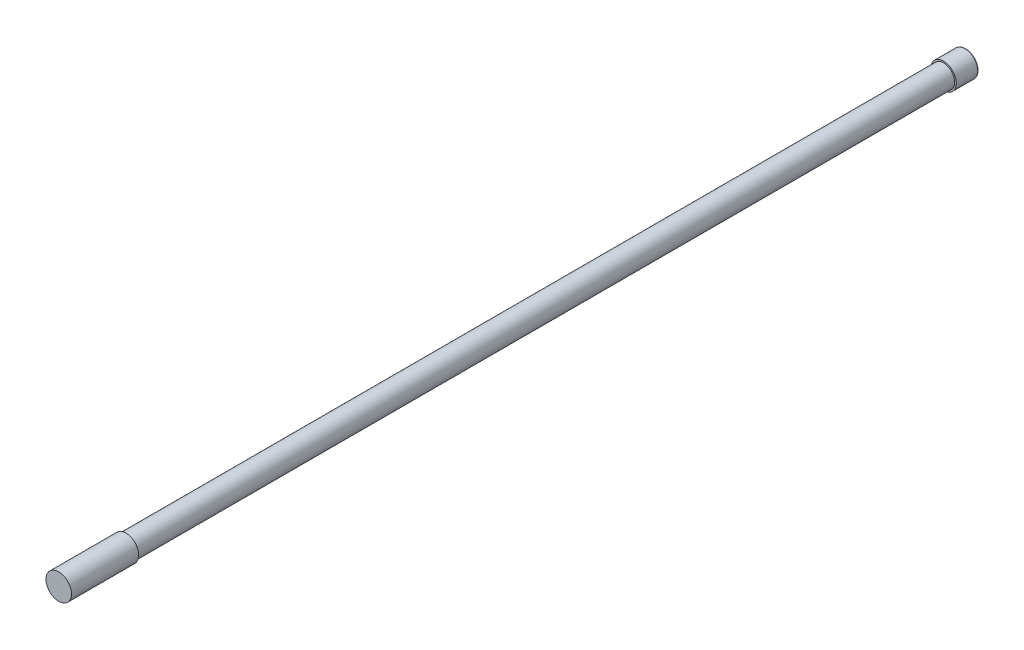
ISO-10303-21;
HEADER;
FILE_DESCRIPTION(('STEP AP214'),'2;1');
FILE_NAME('part.step','',(''),(''),'','','');
FILE_SCHEMA(('AUTOMOTIVE_DESIGN { 1 0 10303 214 1 1 1 1 }'));
ENDSEC;
DATA;
#1=APPLICATION_CONTEXT('core data for automotive mechanical design processes');
#2=APPLICATION_PROTOCOL_DEFINITION('international standard','automotive_design',2000,#1);
#3=PRODUCT_CONTEXT('',#1,'mechanical');
#4=PRODUCT('Part','Part','',(#3));
#5=PRODUCT_RELATED_PRODUCT_CATEGORY('part','',(#4));
#6=PRODUCT_DEFINITION_FORMATION('','',#4);
#7=PRODUCT_DEFINITION_CONTEXT('part definition',#1,'design');
#8=PRODUCT_DEFINITION('design','',#6,#7);
#9=PRODUCT_DEFINITION_SHAPE('','',#8);
#10=(LENGTH_UNIT() NAMED_UNIT(*) SI_UNIT(.MILLI.,.METRE.));
#11=(NAMED_UNIT(*) PLANE_ANGLE_UNIT() SI_UNIT($,.RADIAN.));
#12=(NAMED_UNIT(*) SI_UNIT($,.STERADIAN.) SOLID_ANGLE_UNIT());
#13=UNCERTAINTY_MEASURE_WITH_UNIT(LENGTH_MEASURE(1.E-05),#10,'distance_accuracy_value','');
#14=(GEOMETRIC_REPRESENTATION_CONTEXT(3) GLOBAL_UNCERTAINTY_ASSIGNED_CONTEXT((#13)) GLOBAL_UNIT_ASSIGNED_CONTEXT((#10,
#11,#12)) REPRESENTATION_CONTEXT('',''));
#15=CARTESIAN_POINT('',(0.,0.,0.));
#16=DIRECTION('',(0.,0.,1.));
#17=DIRECTION('',(1.,0.,0.));
#18=AXIS2_PLACEMENT_3D('',#15,#16,#17);
#19=CARTESIAN_POINT('',(0.,0.,-750.));
#20=DIRECTION('',(0.,0.,1.));
#21=DIRECTION('',(1.,0.,0.));
#22=AXIS2_PLACEMENT_3D('',#19,#20,#21);
#23=CYLINDRICAL_SURFACE('',#22,10.);
#24=CARTESIAN_POINT('',(0.,0.,0.));
#25=DIRECTION('',(0.,0.,-1.));
#26=DIRECTION('',(-1.,0.,0.));
#27=AXIS2_PLACEMENT_3D('',#24,#25,#26);
#28=CIRCLE('',#27,10.);
#29=CARTESIAN_POINT('',(-10.,0.,0.));
#30=VERTEX_POINT('',#29);
#31=EDGE_CURVE('E56',#30,#30,#28,.T.);
#32=ORIENTED_EDGE('',*,*,#31,.T.);
#33=EDGE_LOOP('',(#32));
#34=FACE_BOUND('',#33,.T.);
#35=CARTESIAN_POINT('',(0.,0.,-730.));
#36=DIRECTION('',(0.,0.,-1.));
#37=DIRECTION('',(-1.,0.,0.));
#38=AXIS2_PLACEMENT_3D('',#35,#36,#37);
#39=CIRCLE('',#38,10.);
#40=CARTESIAN_POINT('',(-10.,0.,-730.));
#41=VERTEX_POINT('',#40);
#42=EDGE_CURVE('E51',#41,#41,#39,.T.);
#43=ORIENTED_EDGE('',*,*,#42,.F.);
#44=EDGE_LOOP('',(#43));
#45=FACE_BOUND('',#44,.T.);
#46=ADVANCED_FACE('F37',(#34,#45),#23,.T.);
#47=CARTESIAN_POINT('',(0.,0.,60.));
#48=DIRECTION('',(0.,0.,-1.));
#49=DIRECTION('',(-1.,0.,0.));
#50=AXIS2_PLACEMENT_3D('',#47,#48,#49);
#51=CYLINDRICAL_SURFACE('',#50,11.4);
#52=CARTESIAN_POINT('',(0.,0.,60.));
#53=DIRECTION('',(0.,0.,1.));
#54=DIRECTION('',(1.,0.,0.));
#55=AXIS2_PLACEMENT_3D('',#52,#53,#54);
#56=CIRCLE('',#55,11.4);
#57=CARTESIAN_POINT('',(11.4,0.,60.));
#58=VERTEX_POINT('',#57);
#59=EDGE_CURVE('E63',#58,#58,#56,.T.);
#60=ORIENTED_EDGE('',*,*,#59,.F.);
#61=EDGE_LOOP('',(#60));
#62=FACE_BOUND('',#61,.T.);
#63=CARTESIAN_POINT('',(0.,0.,0.));
#64=DIRECTION('',(0.,0.,1.));
#65=DIRECTION('',(1.,0.,0.));
#66=AXIS2_PLACEMENT_3D('',#63,#64,#65);
#67=CIRCLE('',#66,11.4);
#68=CARTESIAN_POINT('',(11.4,0.,0.));
#69=VERTEX_POINT('',#68);
#70=EDGE_CURVE('E59',#69,#69,#67,.T.);
#71=ORIENTED_EDGE('',*,*,#70,.T.);
#72=EDGE_LOOP('',(#71));
#73=FACE_BOUND('',#72,.T.);
#74=ADVANCED_FACE('F89',(#62,#73),#51,.T.);
#75=CARTESIAN_POINT('',(0.,0.,60.));
#76=DIRECTION('',(0.,0.,1.));
#77=DIRECTION('',(1.,0.,0.));
#78=AXIS2_PLACEMENT_3D('',#75,#76,#77);
#79=PLANE('',#78);
#80=ORIENTED_EDGE('',*,*,#59,.T.);
#81=EDGE_LOOP('',(#80));
#82=FACE_BOUND('',#81,.T.);
#83=ADVANCED_FACE('F95',(#82),#79,.T.);
#84=CARTESIAN_POINT('',(0.,0.,0.));
#85=DIRECTION('',(0.,0.,1.));
#86=DIRECTION('',(1.,0.,0.));
#87=AXIS2_PLACEMENT_3D('',#84,#85,#86);
#88=PLANE('',#87);
#89=ORIENTED_EDGE('',*,*,#31,.F.);
#90=EDGE_LOOP('',(#89));
#91=FACE_BOUND('',#90,.T.);
#92=ORIENTED_EDGE('',*,*,#70,.F.);
#93=EDGE_LOOP('',(#92));
#94=FACE_BOUND('',#93,.T.);
#95=ADVANCED_FACE('F86',(#91,#94),#88,.F.);
#96=CARTESIAN_POINT('',(0.,0.,-730.));
#97=DIRECTION('',(0.,0.,-1.));
#98=DIRECTION('',(-1.,0.,0.));
#99=AXIS2_PLACEMENT_3D('',#96,#97,#98);
#100=CYLINDRICAL_SURFACE('',#99,11.4);
#101=CARTESIAN_POINT('',(0.,0.,-749.));
#102=DIRECTION('',(0.,0.,-1.));
#103=DIRECTION('',(-1.,0.,0.));
#104=AXIS2_PLACEMENT_3D('',#101,#102,#103);
#105=CIRCLE('',#104,11.4);
#106=CARTESIAN_POINT('',(-11.4,0.,-749.));
#107=VERTEX_POINT('',#106);
#108=EDGE_CURVE('E10',#107,#107,#105,.F.);
#109=ORIENTED_EDGE('',*,*,#108,.T.);
#110=EDGE_LOOP('',(#109));
#111=FACE_BOUND('',#110,.T.);
#112=CARTESIAN_POINT('',(0.,0.,-730.));
#113=DIRECTION('',(0.,0.,-1.));
#114=DIRECTION('',(-1.,0.,0.));
#115=AXIS2_PLACEMENT_3D('',#112,#113,#114);
#116=CIRCLE('',#115,11.4);
#117=CARTESIAN_POINT('',(-11.4,0.,-730.));
#118=VERTEX_POINT('',#117);
#119=EDGE_CURVE('E64',#118,#118,#116,.T.);
#120=ORIENTED_EDGE('',*,*,#119,.T.);
#121=EDGE_LOOP('',(#120));
#122=FACE_BOUND('',#121,.T.);
#123=ADVANCED_FACE('F74',(#111,#122),#100,.T.);
#124=CARTESIAN_POINT('',(0.,0.,-730.));
#125=DIRECTION('',(0.,0.,-1.));
#126=DIRECTION('',(-1.,0.,0.));
#127=AXIS2_PLACEMENT_3D('',#124,#125,#126);
#128=PLANE('',#127);
#129=ORIENTED_EDGE('',*,*,#42,.T.);
#130=EDGE_LOOP('',(#129));
#131=FACE_BOUND('',#130,.T.);
#132=ORIENTED_EDGE('',*,*,#119,.F.);
#133=EDGE_LOOP('',(#132));
#134=FACE_BOUND('',#133,.T.);
#135=ADVANCED_FACE('F76',(#131,#134),#128,.F.);
#136=CARTESIAN_POINT('',(0.,0.,-750.));
#137=DIRECTION('',(0.,0.,-1.));
#138=DIRECTION('',(-1.,0.,0.));
#139=AXIS2_PLACEMENT_3D('',#136,#137,#138);
#140=PLANE('',#139);
#141=CARTESIAN_POINT('',(0.,0.,-750.));
#142=DIRECTION('',(0.,0.,-1.));
#143=DIRECTION('',(-1.,0.,0.));
#144=AXIS2_PLACEMENT_3D('',#141,#142,#143);
#145=CIRCLE('',#144,10.4);
#146=CARTESIAN_POINT('',(-10.4,0.,-750.));
#147=VERTEX_POINT('',#146);
#148=EDGE_CURVE('E45',#147,#147,#145,.T.);
#149=ORIENTED_EDGE('',*,*,#148,.T.);
#150=EDGE_LOOP('',(#149));
#151=FACE_BOUND('',#150,.T.);
#152=ADVANCED_FACE('F78',(#151),#140,.T.);
#153=CARTESIAN_POINT('',(0.,0.,-749.));
#154=DIRECTION('',(0.,0.,-1.));
#155=DIRECTION('',(-1.,0.,0.));
#156=AXIS2_PLACEMENT_3D('',#153,#154,#155);
#157=TOROIDAL_SURFACE('',#156,10.4,1.);
#158=ORIENTED_EDGE('',*,*,#108,.F.);
#159=EDGE_LOOP('',(#158));
#160=FACE_BOUND('',#159,.T.);
#161=ORIENTED_EDGE('',*,*,#148,.F.);
#162=EDGE_LOOP('',(#161));
#163=FACE_BOUND('',#162,.T.);
#164=ADVANCED_FACE('F39',(#160,#163),#157,.T.);
#165=CLOSED_SHELL('',(#46,#74,#83,#95,#123,#135,#152,#164));
#166=MANIFOLD_SOLID_BREP('B2',#165);
#167=ADVANCED_BREP_SHAPE_REPRESENTATION('',(#18,#166),#14);
#168=SHAPE_DEFINITION_REPRESENTATION(#9,#167);
ENDSEC;
END-ISO-10303-21;
